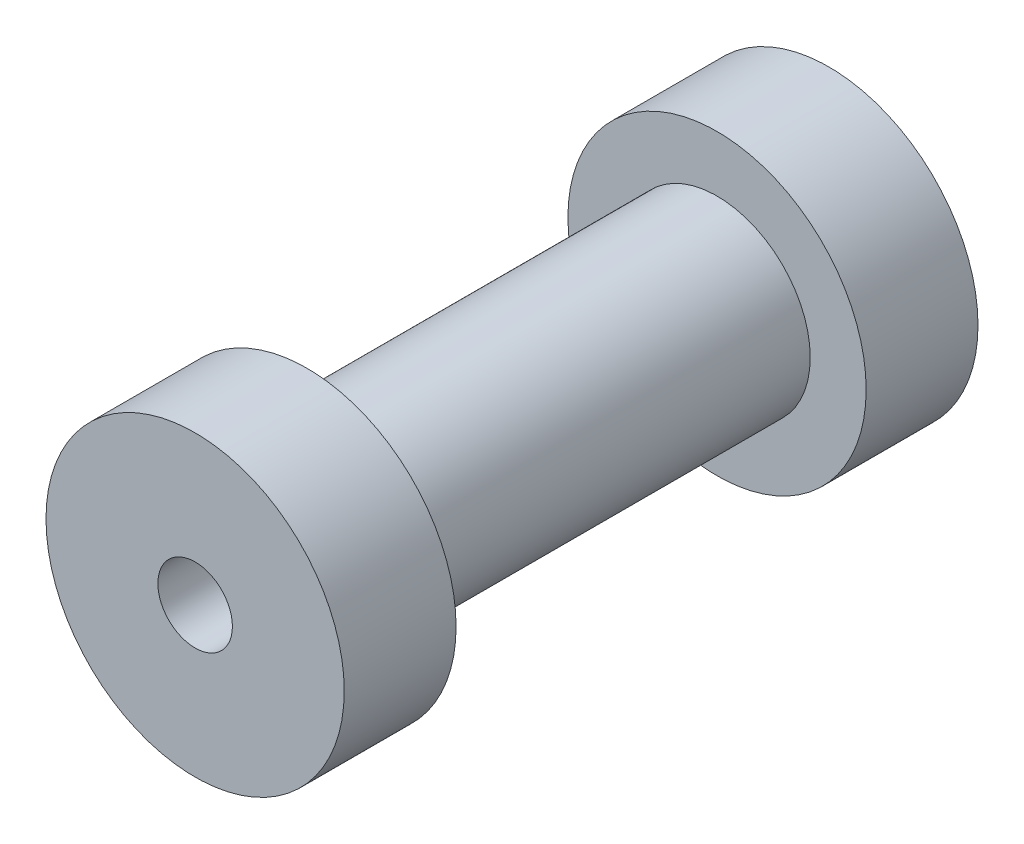
ISO-10303-21;
HEADER;
FILE_DESCRIPTION(('STEP AP214'),'2;1');
FILE_NAME('part.step','',(''),(''),'','','');
FILE_SCHEMA(('AUTOMOTIVE_DESIGN { 1 0 10303 214 1 1 1 1 }'));
ENDSEC;
DATA;
#1=APPLICATION_CONTEXT('core data for automotive mechanical design processes');
#2=APPLICATION_PROTOCOL_DEFINITION('international standard','automotive_design',2000,#1);
#3=PRODUCT_CONTEXT('',#1,'mechanical');
#4=PRODUCT('Part','Part','',(#3));
#5=PRODUCT_RELATED_PRODUCT_CATEGORY('part','',(#4));
#6=PRODUCT_DEFINITION_FORMATION('','',#4);
#7=PRODUCT_DEFINITION_CONTEXT('part definition',#1,'design');
#8=PRODUCT_DEFINITION('design','',#6,#7);
#9=PRODUCT_DEFINITION_SHAPE('','',#8);
#10=(LENGTH_UNIT() NAMED_UNIT(*) SI_UNIT(.MILLI.,.METRE.));
#11=(NAMED_UNIT(*) PLANE_ANGLE_UNIT() SI_UNIT($,.RADIAN.));
#12=(NAMED_UNIT(*) SI_UNIT($,.STERADIAN.) SOLID_ANGLE_UNIT());
#13=UNCERTAINTY_MEASURE_WITH_UNIT(LENGTH_MEASURE(1.E-05),#10,'distance_accuracy_value','');
#14=(GEOMETRIC_REPRESENTATION_CONTEXT(3) GLOBAL_UNCERTAINTY_ASSIGNED_CONTEXT((#13)) GLOBAL_UNIT_ASSIGNED_CONTEXT((#10,
#11,#12)) REPRESENTATION_CONTEXT('',''));
#15=CARTESIAN_POINT('',(0.,0.,0.));
#16=DIRECTION('',(0.,0.,1.));
#17=DIRECTION('',(1.,0.,0.));
#18=AXIS2_PLACEMENT_3D('',#15,#16,#17);
#19=CARTESIAN_POINT('',(0.,0.,17.));
#20=DIRECTION('',(0.,0.,-1.));
#21=DIRECTION('',(-1.,0.,0.));
#22=AXIS2_PLACEMENT_3D('',#19,#20,#21);
#23=CYLINDRICAL_SURFACE('',#22,4.);
#24=CARTESIAN_POINT('',(0.,0.,0.));
#25=DIRECTION('',(0.,0.,1.));
#26=DIRECTION('',(1.,0.,0.));
#27=AXIS2_PLACEMENT_3D('',#24,#25,#26);
#28=CIRCLE('',#27,4.);
#29=CARTESIAN_POINT('',(4.,0.,0.));
#30=VERTEX_POINT('',#29);
#31=EDGE_CURVE('E34',#30,#30,#28,.T.);
#32=ORIENTED_EDGE('',*,*,#31,.T.);
#33=EDGE_LOOP('',(#32));
#34=FACE_BOUND('',#33,.T.);
#35=CARTESIAN_POINT('',(0.,0.,3.));
#36=DIRECTION('',(0.,0.,1.));
#37=DIRECTION('',(1.,0.,0.));
#38=AXIS2_PLACEMENT_3D('',#35,#36,#37);
#39=CIRCLE('',#38,4.);
#40=CARTESIAN_POINT('',(4.,0.,3.));
#41=VERTEX_POINT('',#40);
#42=EDGE_CURVE('E57',#41,#41,#39,.T.);
#43=ORIENTED_EDGE('',*,*,#42,.F.);
#44=EDGE_LOOP('',(#43));
#45=FACE_BOUND('',#44,.T.);
#46=ADVANCED_FACE('F31',(#34,#45),#23,.T.);
#47=CARTESIAN_POINT('',(0.,0.,17.));
#48=DIRECTION('',(0.,0.,1.));
#49=DIRECTION('',(1.,0.,0.));
#50=AXIS2_PLACEMENT_3D('',#47,#48,#49);
#51=CIRCLE('',#50,4.);
#52=CARTESIAN_POINT('',(4.,0.,17.));
#53=VERTEX_POINT('',#52);
#54=EDGE_CURVE('E10',#53,#53,#51,.T.);
#55=ORIENTED_EDGE('',*,*,#54,.F.);
#56=EDGE_LOOP('',(#55));
#57=FACE_BOUND('',#56,.T.);
#58=CARTESIAN_POINT('',(0.,0.,14.));
#59=DIRECTION('',(0.,0.,1.));
#60=DIRECTION('',(1.,0.,0.));
#61=AXIS2_PLACEMENT_3D('',#58,#59,#60);
#62=CIRCLE('',#61,4.);
#63=CARTESIAN_POINT('',(4.,0.,14.));
#64=VERTEX_POINT('',#63);
#65=EDGE_CURVE('E54',#64,#64,#62,.T.);
#66=ORIENTED_EDGE('',*,*,#65,.T.);
#67=EDGE_LOOP('',(#66));
#68=FACE_BOUND('',#67,.T.);
#69=ADVANCED_FACE('F65',(#57,#68),#23,.T.);
#70=CARTESIAN_POINT('',(0.,0.,17.));
#71=DIRECTION('',(0.,0.,1.));
#72=DIRECTION('',(1.,0.,0.));
#73=AXIS2_PLACEMENT_3D('',#70,#71,#72);
#74=PLANE('',#73);
#75=CARTESIAN_POINT('',(0.,0.,17.));
#76=DIRECTION('',(0.,0.,1.));
#77=DIRECTION('',(1.,0.,0.));
#78=AXIS2_PLACEMENT_3D('',#75,#76,#77);
#79=CIRCLE('',#78,1.);
#80=CARTESIAN_POINT('',(1.,0.,17.));
#81=VERTEX_POINT('',#80);
#82=EDGE_CURVE('E43',#81,#81,#79,.T.);
#83=ORIENTED_EDGE('',*,*,#82,.F.);
#84=EDGE_LOOP('',(#83));
#85=FACE_BOUND('',#84,.T.);
#86=ORIENTED_EDGE('',*,*,#54,.T.);
#87=EDGE_LOOP('',(#86));
#88=FACE_BOUND('',#87,.T.);
#89=ADVANCED_FACE('F70',(#85,#88),#74,.T.);
#90=CARTESIAN_POINT('',(0.,0.,0.));
#91=DIRECTION('',(0.,0.,1.));
#92=DIRECTION('',(1.,0.,0.));
#93=AXIS2_PLACEMENT_3D('',#90,#91,#92);
#94=PLANE('',#93);
#95=CARTESIAN_POINT('',(0.,0.,0.));
#96=DIRECTION('',(0.,0.,1.));
#97=DIRECTION('',(1.,0.,0.));
#98=AXIS2_PLACEMENT_3D('',#95,#96,#97);
#99=CIRCLE('',#98,1.);
#100=CARTESIAN_POINT('',(1.,0.,0.));
#101=VERTEX_POINT('',#100);
#102=EDGE_CURVE('E41',#101,#101,#99,.T.);
#103=ORIENTED_EDGE('',*,*,#102,.T.);
#104=EDGE_LOOP('',(#103));
#105=FACE_BOUND('',#104,.T.);
#106=ORIENTED_EDGE('',*,*,#31,.F.);
#107=EDGE_LOOP('',(#106));
#108=FACE_BOUND('',#107,.T.);
#109=ADVANCED_FACE('F74',(#105,#108),#94,.F.);
#110=CARTESIAN_POINT('',(0.,0.,0.));
#111=DIRECTION('',(0.,0.,1.));
#112=DIRECTION('',(1.,0.,0.));
#113=AXIS2_PLACEMENT_3D('',#110,#111,#112);
#114=CYLINDRICAL_SURFACE('',#113,1.);
#115=ORIENTED_EDGE('',*,*,#102,.F.);
#116=EDGE_LOOP('',(#115));
#117=FACE_BOUND('',#116,.T.);
#118=ORIENTED_EDGE('',*,*,#82,.T.);
#119=EDGE_LOOP('',(#118));
#120=FACE_BOUND('',#119,.T.);
#121=ADVANCED_FACE('F76',(#117,#120),#114,.F.);
#122=CARTESIAN_POINT('',(0.,4.,3.));
#123=DIRECTION('',(0.,0.,1.));
#124=DIRECTION('',(1.,0.,0.));
#125=AXIS2_PLACEMENT_3D('',#122,#123,#124);
#126=PLANE('',#125);
#127=ORIENTED_EDGE('',*,*,#42,.T.);
#128=EDGE_LOOP('',(#127));
#129=FACE_BOUND('',#128,.T.);
#130=CARTESIAN_POINT('',(0.,0.,3.));
#131=DIRECTION('',(0.,0.,1.));
#132=DIRECTION('',(1.,0.,0.));
#133=AXIS2_PLACEMENT_3D('',#130,#131,#132);
#134=CIRCLE('',#133,2.5);
#135=CARTESIAN_POINT('',(2.5,0.,3.));
#136=VERTEX_POINT('',#135);
#137=EDGE_CURVE('E46',#136,#136,#134,.T.);
#138=ORIENTED_EDGE('',*,*,#137,.F.);
#139=EDGE_LOOP('',(#138));
#140=FACE_BOUND('',#139,.T.);
#141=ADVANCED_FACE('F61',(#129,#140),#126,.T.);
#142=CARTESIAN_POINT('',(0.,0.,17.));
#143=DIRECTION('',(0.,0.,1.));
#144=DIRECTION('',(1.,0.,0.));
#145=AXIS2_PLACEMENT_3D('',#142,#143,#144);
#146=CYLINDRICAL_SURFACE('',#145,2.5);
#147=ORIENTED_EDGE('',*,*,#137,.T.);
#148=EDGE_LOOP('',(#147));
#149=FACE_BOUND('',#148,.T.);
#150=CARTESIAN_POINT('',(0.,0.,14.));
#151=DIRECTION('',(0.,0.,1.));
#152=DIRECTION('',(1.,0.,0.));
#153=AXIS2_PLACEMENT_3D('',#150,#151,#152);
#154=CIRCLE('',#153,2.5);
#155=CARTESIAN_POINT('',(2.5,0.,14.));
#156=VERTEX_POINT('',#155);
#157=EDGE_CURVE('E51',#156,#156,#154,.T.);
#158=ORIENTED_EDGE('',*,*,#157,.F.);
#159=EDGE_LOOP('',(#158));
#160=FACE_BOUND('',#159,.T.);
#161=ADVANCED_FACE('F89',(#149,#160),#146,.T.);
#162=CARTESIAN_POINT('',(0.,4.,14.));
#163=DIRECTION('',(0.,0.,-1.));
#164=DIRECTION('',(-1.,0.,0.));
#165=AXIS2_PLACEMENT_3D('',#162,#163,#164);
#166=PLANE('',#165);
#167=ORIENTED_EDGE('',*,*,#157,.T.);
#168=EDGE_LOOP('',(#167));
#169=FACE_BOUND('',#168,.T.);
#170=ORIENTED_EDGE('',*,*,#65,.F.);
#171=EDGE_LOOP('',(#170));
#172=FACE_BOUND('',#171,.T.);
#173=ADVANCED_FACE('F92',(#169,#172),#166,.T.);
#174=CLOSED_SHELL('',(#46,#69,#89,#109,#121,#141,#161,#173));
#175=MANIFOLD_SOLID_BREP('B2',#174);
#176=ADVANCED_BREP_SHAPE_REPRESENTATION('',(#18,#175),#14);
#177=SHAPE_DEFINITION_REPRESENTATION(#9,#176);
ENDSEC;
END-ISO-10303-21;
